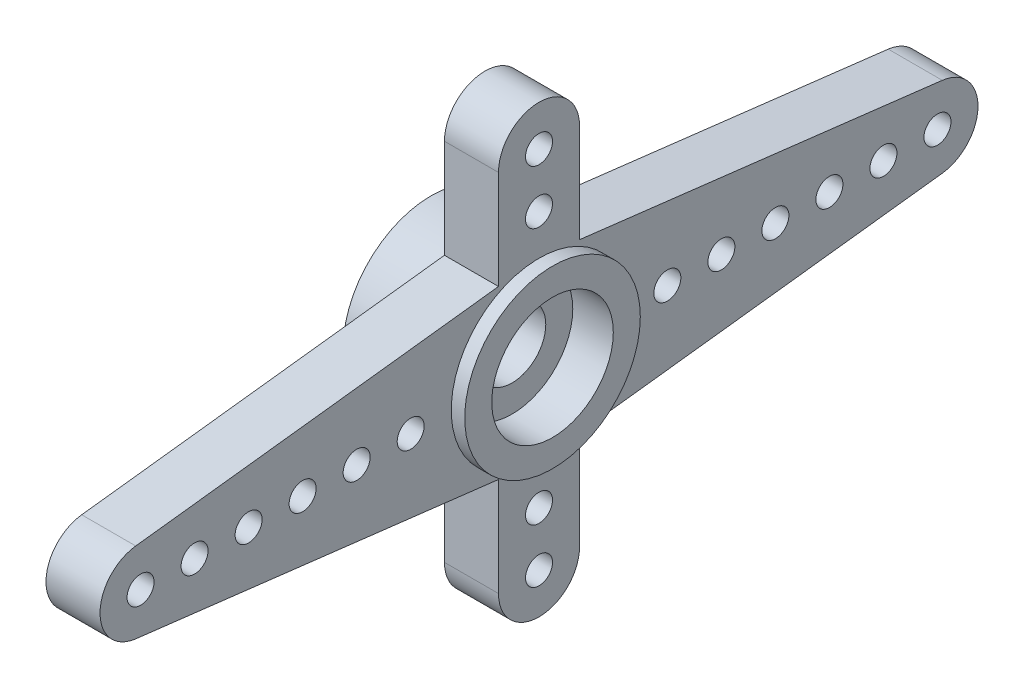
ISO-10303-21;
HEADER;
FILE_DESCRIPTION(('STEP AP214'),'2;1');
FILE_NAME('part.step','',(''),(''),'','','');
FILE_SCHEMA(('AUTOMOTIVE_DESIGN { 1 0 10303 214 1 1 1 1 }'));
ENDSEC;
DATA;
#1=APPLICATION_CONTEXT('core data for automotive mechanical design processes');
#2=APPLICATION_PROTOCOL_DEFINITION('international standard','automotive_design',2000,#1);
#3=PRODUCT_CONTEXT('',#1,'mechanical');
#4=PRODUCT('Part','Part','',(#3));
#5=PRODUCT_RELATED_PRODUCT_CATEGORY('part','',(#4));
#6=PRODUCT_DEFINITION_FORMATION('','',#4);
#7=PRODUCT_DEFINITION_CONTEXT('part definition',#1,'design');
#8=PRODUCT_DEFINITION('design','',#6,#7);
#9=PRODUCT_DEFINITION_SHAPE('','',#8);
#10=(LENGTH_UNIT() NAMED_UNIT(*) SI_UNIT(.MILLI.,.METRE.));
#11=(NAMED_UNIT(*) PLANE_ANGLE_UNIT() SI_UNIT($,.RADIAN.));
#12=(NAMED_UNIT(*) SI_UNIT($,.STERADIAN.) SOLID_ANGLE_UNIT());
#13=UNCERTAINTY_MEASURE_WITH_UNIT(LENGTH_MEASURE(1.E-05),#10,'distance_accuracy_value','');
#14=(GEOMETRIC_REPRESENTATION_CONTEXT(3) GLOBAL_UNCERTAINTY_ASSIGNED_CONTEXT((#13)) GLOBAL_UNIT_ASSIGNED_CONTEXT((#10,
#11,#12)) REPRESENTATION_CONTEXT('',''));
#15=CARTESIAN_POINT('',(0.,0.,0.));
#16=DIRECTION('',(0.,0.,1.));
#17=DIRECTION('',(1.,0.,0.));
#18=AXIS2_PLACEMENT_3D('',#15,#16,#17);
#19=CARTESIAN_POINT('',(0.,0.,0.));
#20=DIRECTION('',(1.,0.,0.));
#21=DIRECTION('',(0.,0.,-1.));
#22=AXIS2_PLACEMENT_3D('',#19,#20,#21);
#23=CYLINDRICAL_SURFACE('',#22,1.25);
#24=CARTESIAN_POINT('',(0.,0.,0.));
#25=DIRECTION('',(1.,0.,0.));
#26=DIRECTION('',(0.,0.,-1.));
#27=AXIS2_PLACEMENT_3D('',#24,#25,#26);
#28=CIRCLE('',#27,1.25);
#29=CARTESIAN_POINT('',(0.,0.,-1.25));
#30=VERTEX_POINT('',#29);
#31=EDGE_CURVE('E710',#30,#30,#28,.T.);
#32=ORIENTED_EDGE('',*,*,#31,.F.);
#33=EDGE_LOOP('',(#32));
#34=FACE_BOUND('',#33,.T.);
#35=CARTESIAN_POINT('',(1.,0.,0.));
#36=DIRECTION('',(1.,0.,0.));
#37=DIRECTION('',(0.,0.,-1.));
#38=AXIS2_PLACEMENT_3D('',#35,#36,#37);
#39=CIRCLE('',#38,1.25);
#40=CARTESIAN_POINT('',(1.,0.,-1.25));
#41=VERTEX_POINT('',#40);
#42=EDGE_CURVE('E676',#41,#41,#39,.T.);
#43=ORIENTED_EDGE('',*,*,#42,.T.);
#44=EDGE_LOOP('',(#43));
#45=FACE_BOUND('',#44,.T.);
#46=ADVANCED_FACE('F39',(#34,#45),#23,.F.);
#47=CARTESIAN_POINT('',(0.,0.,14.75));
#48=DIRECTION('',(1.,0.,0.));
#49=DIRECTION('',(0.,0.,-1.));
#50=AXIS2_PLACEMENT_3D('',#47,#48,#49);
#51=PLANE('',#50);
#52=ORIENTED_EDGE('',*,*,#31,.T.);
#53=EDGE_LOOP('',(#52));
#54=FACE_BOUND('',#53,.T.);
#55=CARTESIAN_POINT('',(0.,0.,0.));
#56=DIRECTION('',(-1.,0.,0.));
#57=DIRECTION('',(0.,0.,1.));
#58=AXIS2_PLACEMENT_3D('',#55,#56,#57);
#59=CIRCLE('',#58,2.25);
#60=CARTESIAN_POINT('',(0.,0.,2.25));
#61=VERTEX_POINT('',#60);
#62=EDGE_CURVE('E695',#61,#61,#59,.T.);
#63=ORIENTED_EDGE('',*,*,#62,.T.);
#64=EDGE_LOOP('',(#63));
#65=FACE_BOUND('',#64,.T.);
#66=ADVANCED_FACE('F307',(#54,#65),#51,.F.);
#67=CARTESIAN_POINT('',(2.,0.,14.75));
#68=DIRECTION('',(1.,0.,0.));
#69=DIRECTION('',(0.,0.,-1.));
#70=AXIS2_PLACEMENT_3D('',#67,#68,#69);
#71=PLANE('',#70);
#72=CARTESIAN_POINT('',(2.,0.,0.));
#73=DIRECTION('',(1.,0.,0.));
#74=DIRECTION('',(0.,0.,-1.));
#75=AXIS2_PLACEMENT_3D('',#72,#73,#74);
#76=CIRCLE('',#75,3.25);
#77=CARTESIAN_POINT('',(2.,0.,-3.25));
#78=VERTEX_POINT('',#77);
#79=EDGE_CURVE('E687',#78,#78,#76,.T.);
#80=ORIENTED_EDGE('',*,*,#79,.F.);
#81=EDGE_LOOP('',(#80));
#82=FACE_BOUND('',#81,.T.);
#83=CARTESIAN_POINT('',(2.,-4.75,0.));
#84=DIRECTION('',(1.,0.,0.));
#85=DIRECTION('',(0.,0.,1.));
#86=AXIS2_PLACEMENT_3D('',#83,#84,#85);
#87=CIRCLE('',#86,0.5);
#88=CARTESIAN_POINT('',(2.,-4.75,0.5));
#89=VERTEX_POINT('',#88);
#90=EDGE_CURVE('E723',#89,#89,#87,.T.);
#91=ORIENTED_EDGE('',*,*,#90,.F.);
#92=EDGE_LOOP('',(#91));
#93=FACE_BOUND('',#92,.T.);
#94=CARTESIAN_POINT('',(2.,4.75,0.));
#95=DIRECTION('',(1.,0.,0.));
#96=DIRECTION('',(0.,0.,-1.));
#97=AXIS2_PLACEMENT_3D('',#94,#95,#96);
#98=CIRCLE('',#97,0.5);
#99=CARTESIAN_POINT('',(2.,4.75,-0.5));
#100=VERTEX_POINT('',#99);
#101=EDGE_CURVE('E739',#100,#100,#98,.T.);
#102=ORIENTED_EDGE('',*,*,#101,.F.);
#103=EDGE_LOOP('',(#102));
#104=FACE_BOUND('',#103,.T.);
#105=CARTESIAN_POINT('',(2.,0.,6.75));
#106=DIRECTION('',(1.,0.,0.));
#107=DIRECTION('',(0.,0.,1.));
#108=AXIS2_PLACEMENT_3D('',#105,#106,#107);
#109=CIRCLE('',#108,0.500000000000001);
#110=CARTESIAN_POINT('',(2.,0.,7.25));
#111=VERTEX_POINT('',#110);
#112=EDGE_CURVE('E755',#111,#111,#109,.T.);
#113=ORIENTED_EDGE('',*,*,#112,.F.);
#114=EDGE_LOOP('',(#113));
#115=FACE_BOUND('',#114,.T.);
#116=CARTESIAN_POINT('',(2.,0.,10.75));
#117=DIRECTION('',(1.,0.,0.));
#118=DIRECTION('',(0.,0.,1.));
#119=AXIS2_PLACEMENT_3D('',#116,#117,#118);
#120=CIRCLE('',#119,0.500000000000002);
#121=CARTESIAN_POINT('',(2.,0.,11.25));
#122=VERTEX_POINT('',#121);
#123=EDGE_CURVE('E771',#122,#122,#120,.T.);
#124=ORIENTED_EDGE('',*,*,#123,.F.);
#125=EDGE_LOOP('',(#124));
#126=FACE_BOUND('',#125,.T.);
#127=CARTESIAN_POINT('',(2.,0.,14.75));
#128=DIRECTION('',(1.,0.,0.));
#129=DIRECTION('',(0.,0.,1.));
#130=AXIS2_PLACEMENT_3D('',#127,#128,#129);
#131=CIRCLE('',#130,0.500000000000002);
#132=CARTESIAN_POINT('',(2.,0.,15.25));
#133=VERTEX_POINT('',#132);
#134=EDGE_CURVE('E787',#133,#133,#131,.T.);
#135=ORIENTED_EDGE('',*,*,#134,.F.);
#136=EDGE_LOOP('',(#135));
#137=FACE_BOUND('',#136,.T.);
#138=CARTESIAN_POINT('',(2.,0.,-12.75));
#139=DIRECTION('',(1.,0.,0.));
#140=DIRECTION('',(0.,0.,-1.));
#141=AXIS2_PLACEMENT_3D('',#138,#139,#140);
#142=CIRCLE('',#141,0.499999999999999);
#143=CARTESIAN_POINT('',(2.,0.,-13.25));
#144=VERTEX_POINT('',#143);
#145=EDGE_CURVE('E803',#144,#144,#142,.T.);
#146=ORIENTED_EDGE('',*,*,#145,.F.);
#147=EDGE_LOOP('',(#146));
#148=FACE_BOUND('',#147,.T.);
#149=CARTESIAN_POINT('',(2.,0.,-8.75));
#150=DIRECTION('',(1.,0.,0.));
#151=DIRECTION('',(0.,0.,-1.));
#152=AXIS2_PLACEMENT_3D('',#149,#150,#151);
#153=CIRCLE('',#152,0.499999999999999);
#154=CARTESIAN_POINT('',(2.,0.,-9.25));
#155=VERTEX_POINT('',#154);
#156=EDGE_CURVE('E819',#155,#155,#153,.T.);
#157=ORIENTED_EDGE('',*,*,#156,.F.);
#158=EDGE_LOOP('',(#157));
#159=FACE_BOUND('',#158,.T.);
#160=CARTESIAN_POINT('',(2.,0.,-4.75));
#161=DIRECTION('',(1.,0.,0.));
#162=DIRECTION('',(0.,0.,-1.));
#163=AXIS2_PLACEMENT_3D('',#160,#161,#162);
#164=CIRCLE('',#163,0.500000000000001);
#165=CARTESIAN_POINT('',(2.,0.,-5.25));
#166=VERTEX_POINT('',#165);
#167=EDGE_CURVE('E172',#166,#166,#164,.T.);
#168=ORIENTED_EDGE('',*,*,#167,.F.);
#169=EDGE_LOOP('',(#168));
#170=FACE_BOUND('',#169,.T.);
#171=CARTESIAN_POINT('',(2.,0.,14.75));
#172=DIRECTION('',(1.,0.,0.));
#173=DIRECTION('',(0.,0.,-1.));
#174=AXIS2_PLACEMENT_3D('',#171,#172,#173);
#175=CIRCLE('',#174,1.5);
#176=CARTESIAN_POINT('',(2.,1.48940527280103,14.9279661016949));
#177=VERTEX_POINT('',#176);
#178=CARTESIAN_POINT('',(2.,-1.48940527280103,14.9279661016949));
#179=VERTEX_POINT('',#178);
#180=EDGE_CURVE('E202',#177,#179,#175,.T.);
#181=ORIENTED_EDGE('',*,*,#180,.T.);
#182=DIRECTION('',(0.,-0.11864406779661,-0.992936848534021));
#183=VECTOR('',#182,1.);
#184=CARTESIAN_POINT('',(2.,-1.48940527280103,14.9279661016949));
#185=LINE('',#184,#183);
#186=CARTESIAN_POINT('',(2.,-3.0938864871826,1.5));
#187=VERTEX_POINT('',#186);
#188=EDGE_CURVE('E113',#179,#187,#185,.T.);
#189=ORIENTED_EDGE('',*,*,#188,.T.);
#190=DIRECTION('',(0.,-1.,0.));
#191=VECTOR('',#190,1.);
#192=CARTESIAN_POINT('',(2.,-6.75,1.5));
#193=LINE('',#192,#191);
#194=CARTESIAN_POINT('',(2.,-6.75,1.5));
#195=VERTEX_POINT('',#194);
#196=EDGE_CURVE('E260',#187,#195,#193,.T.);
#197=ORIENTED_EDGE('',*,*,#196,.T.);
#198=CARTESIAN_POINT('',(2.,-6.75,0.));
#199=DIRECTION('',(1.,0.,0.));
#200=DIRECTION('',(0.,0.,1.));
#201=AXIS2_PLACEMENT_3D('',#198,#199,#200);
#202=CIRCLE('',#201,1.5);
#203=CARTESIAN_POINT('',(2.,-6.75,-1.5));
#204=VERTEX_POINT('',#203);
#205=EDGE_CURVE('E256',#195,#204,#202,.T.);
#206=ORIENTED_EDGE('',*,*,#205,.T.);
#207=DIRECTION('',(0.,1.,0.));
#208=VECTOR('',#207,1.);
#209=CARTESIAN_POINT('',(2.,-6.75,-1.5));
#210=LINE('',#209,#208);
#211=CARTESIAN_POINT('',(2.,-3.0938864871826,-1.5));
#212=VERTEX_POINT('',#211);
#213=EDGE_CURVE('E259',#204,#212,#210,.T.);
#214=ORIENTED_EDGE('',*,*,#213,.T.);
#215=DIRECTION('',(0.,0.11864406779661,-0.992936848534021));
#216=VECTOR('',#215,1.);
#217=CARTESIAN_POINT('',(2.,-1.48940527280103,-14.9279661016949));
#218=LINE('',#217,#216);
#219=CARTESIAN_POINT('',(2.,-1.48940527280103,-14.9279661016949));
#220=VERTEX_POINT('',#219);
#221=EDGE_CURVE('E264',#212,#220,#218,.T.);
#222=ORIENTED_EDGE('',*,*,#221,.T.);
#223=CARTESIAN_POINT('',(2.,0.,-14.75));
#224=DIRECTION('',(1.,0.,0.));
#225=DIRECTION('',(0.,0.,1.));
#226=AXIS2_PLACEMENT_3D('',#223,#224,#225);
#227=CIRCLE('',#226,1.5);
#228=CARTESIAN_POINT('',(2.,1.48940527280103,-14.9279661016949));
#229=VERTEX_POINT('',#228);
#230=EDGE_CURVE('E271',#220,#229,#227,.T.);
#231=ORIENTED_EDGE('',*,*,#230,.T.);
#232=DIRECTION('',(0.,0.11864406779661,0.992936848534021));
#233=VECTOR('',#232,1.);
#234=CARTESIAN_POINT('',(2.,1.48940527280103,-14.9279661016949));
#235=LINE('',#234,#233);
#236=CARTESIAN_POINT('',(2.,3.0938864871826,-1.5));
#237=VERTEX_POINT('',#236);
#238=EDGE_CURVE('E274',#229,#237,#235,.T.);
#239=ORIENTED_EDGE('',*,*,#238,.T.);
#240=DIRECTION('',(0.,1.,0.));
#241=VECTOR('',#240,1.);
#242=CARTESIAN_POINT('',(2.,6.75,-1.5));
#243=LINE('',#242,#241);
#244=CARTESIAN_POINT('',(2.,6.75,-1.5));
#245=VERTEX_POINT('',#244);
#246=EDGE_CURVE('E145',#237,#245,#243,.T.);
#247=ORIENTED_EDGE('',*,*,#246,.T.);
#248=CARTESIAN_POINT('',(2.,6.75,0.));
#249=DIRECTION('',(1.,0.,0.));
#250=DIRECTION('',(0.,0.,-1.));
#251=AXIS2_PLACEMENT_3D('',#248,#249,#250);
#252=CIRCLE('',#251,1.5);
#253=CARTESIAN_POINT('',(2.,6.75,1.5));
#254=VERTEX_POINT('',#253);
#255=EDGE_CURVE('E138',#245,#254,#252,.T.);
#256=ORIENTED_EDGE('',*,*,#255,.T.);
#257=DIRECTION('',(0.,-1.,0.));
#258=VECTOR('',#257,1.);
#259=CARTESIAN_POINT('',(2.,6.75,1.5));
#260=LINE('',#259,#258);
#261=CARTESIAN_POINT('',(2.,3.0938864871826,1.5));
#262=VERTEX_POINT('',#261);
#263=EDGE_CURVE('E143',#254,#262,#260,.T.);
#264=ORIENTED_EDGE('',*,*,#263,.T.);
#265=DIRECTION('',(0.,-0.11864406779661,0.992936848534021));
#266=VECTOR('',#265,1.);
#267=CARTESIAN_POINT('',(2.,1.48940527280103,14.9279661016949));
#268=LINE('',#267,#266);
#269=EDGE_CURVE('E57',#262,#177,#268,.T.);
#270=ORIENTED_EDGE('',*,*,#269,.T.);
#271=EDGE_LOOP('',(#181,#189,#197,#206,#214,#222,#231,#239,#247,#256,#264,#270));
#272=FACE_BOUND('',#271,.T.);
#273=CARTESIAN_POINT('',(2.,0.,-6.75));
#274=DIRECTION('',(1.,0.,0.));
#275=DIRECTION('',(0.,0.,-1.));
#276=AXIS2_PLACEMENT_3D('',#273,#274,#275);
#277=CIRCLE('',#276,0.500000000000001);
#278=CARTESIAN_POINT('',(2.,0.,-7.25));
#279=VERTEX_POINT('',#278);
#280=EDGE_CURVE('E827',#279,#279,#277,.T.);
#281=ORIENTED_EDGE('',*,*,#280,.F.);
#282=EDGE_LOOP('',(#281));
#283=FACE_BOUND('',#282,.T.);
#284=CARTESIAN_POINT('',(2.,0.,-10.75));
#285=DIRECTION('',(1.,0.,0.));
#286=DIRECTION('',(0.,0.,-1.));
#287=AXIS2_PLACEMENT_3D('',#284,#285,#286);
#288=CIRCLE('',#287,0.500000000000002);
#289=CARTESIAN_POINT('',(2.,0.,-11.25));
#290=VERTEX_POINT('',#289);
#291=EDGE_CURVE('E811',#290,#290,#288,.T.);
#292=ORIENTED_EDGE('',*,*,#291,.F.);
#293=EDGE_LOOP('',(#292));
#294=FACE_BOUND('',#293,.T.);
#295=CARTESIAN_POINT('',(2.,0.,-14.75));
#296=DIRECTION('',(1.,0.,0.));
#297=DIRECTION('',(0.,0.,-1.));
#298=AXIS2_PLACEMENT_3D('',#295,#296,#297);
#299=CIRCLE('',#298,0.500000000000002);
#300=CARTESIAN_POINT('',(2.,0.,-15.25));
#301=VERTEX_POINT('',#300);
#302=EDGE_CURVE('E795',#301,#301,#299,.T.);
#303=ORIENTED_EDGE('',*,*,#302,.F.);
#304=EDGE_LOOP('',(#303));
#305=FACE_BOUND('',#304,.T.);
#306=CARTESIAN_POINT('',(2.,0.,12.75));
#307=DIRECTION('',(1.,0.,0.));
#308=DIRECTION('',(0.,0.,1.));
#309=AXIS2_PLACEMENT_3D('',#306,#307,#308);
#310=CIRCLE('',#309,0.499999999999999);
#311=CARTESIAN_POINT('',(2.,0.,13.25));
#312=VERTEX_POINT('',#311);
#313=EDGE_CURVE('E779',#312,#312,#310,.T.);
#314=ORIENTED_EDGE('',*,*,#313,.F.);
#315=EDGE_LOOP('',(#314));
#316=FACE_BOUND('',#315,.T.);
#317=CARTESIAN_POINT('',(2.,0.,8.75));
#318=DIRECTION('',(1.,0.,0.));
#319=DIRECTION('',(0.,0.,1.));
#320=AXIS2_PLACEMENT_3D('',#317,#318,#319);
#321=CIRCLE('',#320,0.499999999999999);
#322=CARTESIAN_POINT('',(2.,0.,9.25));
#323=VERTEX_POINT('',#322);
#324=EDGE_CURVE('E763',#323,#323,#321,.T.);
#325=ORIENTED_EDGE('',*,*,#324,.F.);
#326=EDGE_LOOP('',(#325));
#327=FACE_BOUND('',#326,.T.);
#328=CARTESIAN_POINT('',(2.,0.,4.75));
#329=DIRECTION('',(1.,0.,0.));
#330=DIRECTION('',(0.,0.,1.));
#331=AXIS2_PLACEMENT_3D('',#328,#329,#330);
#332=CIRCLE('',#331,0.500000000000001);
#333=CARTESIAN_POINT('',(2.,0.,5.25));
#334=VERTEX_POINT('',#333);
#335=EDGE_CURVE('E747',#334,#334,#332,.T.);
#336=ORIENTED_EDGE('',*,*,#335,.F.);
#337=EDGE_LOOP('',(#336));
#338=FACE_BOUND('',#337,.T.);
#339=CARTESIAN_POINT('',(2.,6.75,0.));
#340=DIRECTION('',(1.,0.,0.));
#341=DIRECTION('',(0.,0.,-1.));
#342=AXIS2_PLACEMENT_3D('',#339,#340,#341);
#343=CIRCLE('',#342,0.5);
#344=CARTESIAN_POINT('',(2.,6.75,-0.5));
#345=VERTEX_POINT('',#344);
#346=EDGE_CURVE('E731',#345,#345,#343,.T.);
#347=ORIENTED_EDGE('',*,*,#346,.F.);
#348=EDGE_LOOP('',(#347));
#349=FACE_BOUND('',#348,.T.);
#350=CARTESIAN_POINT('',(2.,-6.75,0.));
#351=DIRECTION('',(1.,0.,0.));
#352=DIRECTION('',(0.,0.,1.));
#353=AXIS2_PLACEMENT_3D('',#350,#351,#352);
#354=CIRCLE('',#353,0.5);
#355=CARTESIAN_POINT('',(2.,-6.75,0.5));
#356=VERTEX_POINT('',#355);
#357=EDGE_CURVE('E715',#356,#356,#354,.T.);
#358=ORIENTED_EDGE('',*,*,#357,.F.);
#359=EDGE_LOOP('',(#358));
#360=FACE_BOUND('',#359,.T.);
#361=ADVANCED_FACE('F140',(#82,#93,#104,#115,#126,#137,#148,#159,#170,#272,#283,#294,#305,#316,
#327,#338,#349,#360),#71,.T.);
#362=CARTESIAN_POINT('',(0.,0.,0.));
#363=DIRECTION('',(1.,0.,0.));
#364=DIRECTION('',(0.,0.,-1.));
#365=AXIS2_PLACEMENT_3D('',#362,#363,#364);
#366=CIRCLE('',#365,3.25);
#367=CARTESIAN_POINT('',(0.,0.,-3.25));
#368=VERTEX_POINT('',#367);
#369=EDGE_CURVE('E11',#368,#368,#366,.F.);
#370=ORIENTED_EDGE('',*,*,#369,.F.);
#371=EDGE_LOOP('',(#370));
#372=FACE_BOUND('',#371,.T.);
#373=CARTESIAN_POINT('',(0.,0.,14.75));
#374=DIRECTION('',(1.,0.,0.));
#375=DIRECTION('',(0.,0.,-1.));
#376=AXIS2_PLACEMENT_3D('',#373,#374,#375);
#377=CIRCLE('',#376,1.5);
#378=CARTESIAN_POINT('',(0.,1.48940527280103,14.9279661016949));
#379=VERTEX_POINT('',#378);
#380=CARTESIAN_POINT('',(0.,-1.48940527280103,14.9279661016949));
#381=VERTEX_POINT('',#380);
#382=EDGE_CURVE('E167',#379,#381,#377,.T.);
#383=ORIENTED_EDGE('',*,*,#382,.F.);
#384=DIRECTION('',(0.,-0.11864406779661,0.992936848534021));
#385=VECTOR('',#384,1.);
#386=CARTESIAN_POINT('',(0.,1.48940527280103,14.9279661016949));
#387=LINE('',#386,#385);
#388=CARTESIAN_POINT('',(0.,3.0938864871826,1.5));
#389=VERTEX_POINT('',#388);
#390=EDGE_CURVE('E104',#389,#379,#387,.T.);
#391=ORIENTED_EDGE('',*,*,#390,.F.);
#392=DIRECTION('',(0.,-1.,0.));
#393=VECTOR('',#392,1.);
#394=CARTESIAN_POINT('',(0.,6.75,1.5));
#395=LINE('',#394,#393);
#396=CARTESIAN_POINT('',(0.,6.75,1.5));
#397=VERTEX_POINT('',#396);
#398=EDGE_CURVE('E98',#397,#389,#395,.T.);
#399=ORIENTED_EDGE('',*,*,#398,.F.);
#400=CARTESIAN_POINT('',(0.,6.75,0.));
#401=DIRECTION('',(1.,0.,0.));
#402=DIRECTION('',(0.,0.,-1.));
#403=AXIS2_PLACEMENT_3D('',#400,#401,#402);
#404=CIRCLE('',#403,1.5);
#405=CARTESIAN_POINT('',(0.,6.75,-1.5));
#406=VERTEX_POINT('',#405);
#407=EDGE_CURVE('E154',#406,#397,#404,.T.);
#408=ORIENTED_EDGE('',*,*,#407,.F.);
#409=DIRECTION('',(0.,1.,0.));
#410=VECTOR('',#409,1.);
#411=CARTESIAN_POINT('',(0.,6.75,-1.5));
#412=LINE('',#411,#410);
#413=CARTESIAN_POINT('',(0.,3.0938864871826,-1.5));
#414=VERTEX_POINT('',#413);
#415=EDGE_CURVE('E193',#414,#406,#412,.T.);
#416=ORIENTED_EDGE('',*,*,#415,.F.);
#417=DIRECTION('',(0.,0.11864406779661,0.992936848534021));
#418=VECTOR('',#417,1.);
#419=CARTESIAN_POINT('',(0.,1.48940527280103,-14.9279661016949));
#420=LINE('',#419,#418);
#421=CARTESIAN_POINT('',(0.,1.48940527280103,-14.9279661016949));
#422=VERTEX_POINT('',#421);
#423=EDGE_CURVE('E190',#422,#414,#420,.T.);
#424=ORIENTED_EDGE('',*,*,#423,.F.);
#425=CARTESIAN_POINT('',(0.,0.,-14.75));
#426=DIRECTION('',(1.,0.,0.));
#427=DIRECTION('',(0.,0.,1.));
#428=AXIS2_PLACEMENT_3D('',#425,#426,#427);
#429=CIRCLE('',#428,1.5);
#430=CARTESIAN_POINT('',(0.,-1.48940527280103,-14.9279661016949));
#431=VERTEX_POINT('',#430);
#432=EDGE_CURVE('E187',#431,#422,#429,.T.);
#433=ORIENTED_EDGE('',*,*,#432,.F.);
#434=DIRECTION('',(0.,0.11864406779661,-0.992936848534021));
#435=VECTOR('',#434,1.);
#436=CARTESIAN_POINT('',(0.,-1.48940527280103,-14.9279661016949));
#437=LINE('',#436,#435);
#438=CARTESIAN_POINT('',(0.,-3.0938864871826,-1.5));
#439=VERTEX_POINT('',#438);
#440=EDGE_CURVE('E184',#439,#431,#437,.T.);
#441=ORIENTED_EDGE('',*,*,#440,.F.);
#442=DIRECTION('',(0.,1.,0.));
#443=VECTOR('',#442,1.);
#444=CARTESIAN_POINT('',(0.,-6.75,-1.5));
#445=LINE('',#444,#443);
#446=CARTESIAN_POINT('',(0.,-6.75,-1.5));
#447=VERTEX_POINT('',#446);
#448=EDGE_CURVE('E181',#447,#439,#445,.T.);
#449=ORIENTED_EDGE('',*,*,#448,.F.);
#450=CARTESIAN_POINT('',(0.,-6.75,0.));
#451=DIRECTION('',(1.,0.,0.));
#452=DIRECTION('',(0.,0.,1.));
#453=AXIS2_PLACEMENT_3D('',#450,#451,#452);
#454=CIRCLE('',#453,1.5);
#455=CARTESIAN_POINT('',(0.,-6.75,1.5));
#456=VERTEX_POINT('',#455);
#457=EDGE_CURVE('E178',#456,#447,#454,.T.);
#458=ORIENTED_EDGE('',*,*,#457,.F.);
#459=DIRECTION('',(0.,-1.,0.));
#460=VECTOR('',#459,1.);
#461=CARTESIAN_POINT('',(0.,-6.75,1.5));
#462=LINE('',#461,#460);
#463=CARTESIAN_POINT('',(0.,-3.0938864871826,1.5));
#464=VERTEX_POINT('',#463);
#465=EDGE_CURVE('E175',#464,#456,#462,.T.);
#466=ORIENTED_EDGE('',*,*,#465,.F.);
#467=DIRECTION('',(0.,-0.11864406779661,-0.992936848534021));
#468=VECTOR('',#467,1.);
#469=CARTESIAN_POINT('',(0.,-1.48940527280103,14.9279661016949));
#470=LINE('',#469,#468);
#471=EDGE_CURVE('E171',#381,#464,#470,.T.);
#472=ORIENTED_EDGE('',*,*,#471,.F.);
#473=EDGE_LOOP('',(#383,#391,#399,#408,#416,#424,#433,#441,#449,#458,#466,#472));
#474=FACE_BOUND('',#473,.T.);
#475=CARTESIAN_POINT('',(0.,0.,-4.75));
#476=DIRECTION('',(1.,0.,0.));
#477=DIRECTION('',(0.,0.,-1.));
#478=AXIS2_PLACEMENT_3D('',#475,#476,#477);
#479=CIRCLE('',#478,0.500000000000001);
#480=CARTESIAN_POINT('',(0.,0.,-5.25));
#481=VERTEX_POINT('',#480);
#482=EDGE_CURVE('E831',#481,#481,#479,.T.);
#483=ORIENTED_EDGE('',*,*,#482,.T.);
#484=EDGE_LOOP('',(#483));
#485=FACE_BOUND('',#484,.T.);
#486=CARTESIAN_POINT('',(0.,0.,-6.75));
#487=DIRECTION('',(1.,0.,0.));
#488=DIRECTION('',(0.,0.,-1.));
#489=AXIS2_PLACEMENT_3D('',#486,#487,#488);
#490=CIRCLE('',#489,0.500000000000001);
#491=CARTESIAN_POINT('',(0.,0.,-7.25));
#492=VERTEX_POINT('',#491);
#493=EDGE_CURVE('E823',#492,#492,#490,.T.);
#494=ORIENTED_EDGE('',*,*,#493,.T.);
#495=EDGE_LOOP('',(#494));
#496=FACE_BOUND('',#495,.T.);
#497=CARTESIAN_POINT('',(0.,0.,-8.75));
#498=DIRECTION('',(1.,0.,0.));
#499=DIRECTION('',(0.,0.,-1.));
#500=AXIS2_PLACEMENT_3D('',#497,#498,#499);
#501=CIRCLE('',#500,0.499999999999999);
#502=CARTESIAN_POINT('',(0.,0.,-9.25));
#503=VERTEX_POINT('',#502);
#504=EDGE_CURVE('E815',#503,#503,#501,.T.);
#505=ORIENTED_EDGE('',*,*,#504,.T.);
#506=EDGE_LOOP('',(#505));
#507=FACE_BOUND('',#506,.T.);
#508=CARTESIAN_POINT('',(0.,0.,-10.75));
#509=DIRECTION('',(1.,0.,0.));
#510=DIRECTION('',(0.,0.,-1.));
#511=AXIS2_PLACEMENT_3D('',#508,#509,#510);
#512=CIRCLE('',#511,0.500000000000002);
#513=CARTESIAN_POINT('',(0.,0.,-11.25));
#514=VERTEX_POINT('',#513);
#515=EDGE_CURVE('E807',#514,#514,#512,.T.);
#516=ORIENTED_EDGE('',*,*,#515,.T.);
#517=EDGE_LOOP('',(#516));
#518=FACE_BOUND('',#517,.T.);
#519=CARTESIAN_POINT('',(0.,0.,-12.75));
#520=DIRECTION('',(1.,0.,0.));
#521=DIRECTION('',(0.,0.,-1.));
#522=AXIS2_PLACEMENT_3D('',#519,#520,#521);
#523=CIRCLE('',#522,0.499999999999999);
#524=CARTESIAN_POINT('',(0.,0.,-13.25));
#525=VERTEX_POINT('',#524);
#526=EDGE_CURVE('E799',#525,#525,#523,.T.);
#527=ORIENTED_EDGE('',*,*,#526,.T.);
#528=EDGE_LOOP('',(#527));
#529=FACE_BOUND('',#528,.T.);
#530=CARTESIAN_POINT('',(0.,0.,-14.75));
#531=DIRECTION('',(1.,0.,0.));
#532=DIRECTION('',(0.,0.,-1.));
#533=AXIS2_PLACEMENT_3D('',#530,#531,#532);
#534=CIRCLE('',#533,0.500000000000002);
#535=CARTESIAN_POINT('',(0.,0.,-15.25));
#536=VERTEX_POINT('',#535);
#537=EDGE_CURVE('E791',#536,#536,#534,.T.);
#538=ORIENTED_EDGE('',*,*,#537,.T.);
#539=EDGE_LOOP('',(#538));
#540=FACE_BOUND('',#539,.T.);
#541=CARTESIAN_POINT('',(0.,0.,14.75));
#542=DIRECTION('',(1.,0.,0.));
#543=DIRECTION('',(0.,0.,1.));
#544=AXIS2_PLACEMENT_3D('',#541,#542,#543);
#545=CIRCLE('',#544,0.500000000000002);
#546=CARTESIAN_POINT('',(0.,0.,15.25));
#547=VERTEX_POINT('',#546);
#548=EDGE_CURVE('E783',#547,#547,#545,.T.);
#549=ORIENTED_EDGE('',*,*,#548,.T.);
#550=EDGE_LOOP('',(#549));
#551=FACE_BOUND('',#550,.T.);
#552=CARTESIAN_POINT('',(0.,0.,12.75));
#553=DIRECTION('',(1.,0.,0.));
#554=DIRECTION('',(0.,0.,1.));
#555=AXIS2_PLACEMENT_3D('',#552,#553,#554);
#556=CIRCLE('',#555,0.499999999999999);
#557=CARTESIAN_POINT('',(0.,0.,13.25));
#558=VERTEX_POINT('',#557);
#559=EDGE_CURVE('E775',#558,#558,#556,.T.);
#560=ORIENTED_EDGE('',*,*,#559,.T.);
#561=EDGE_LOOP('',(#560));
#562=FACE_BOUND('',#561,.T.);
#563=CARTESIAN_POINT('',(0.,0.,10.75));
#564=DIRECTION('',(1.,0.,0.));
#565=DIRECTION('',(0.,0.,1.));
#566=AXIS2_PLACEMENT_3D('',#563,#564,#565);
#567=CIRCLE('',#566,0.500000000000002);
#568=CARTESIAN_POINT('',(0.,0.,11.25));
#569=VERTEX_POINT('',#568);
#570=EDGE_CURVE('E767',#569,#569,#567,.T.);
#571=ORIENTED_EDGE('',*,*,#570,.T.);
#572=EDGE_LOOP('',(#571));
#573=FACE_BOUND('',#572,.T.);
#574=CARTESIAN_POINT('',(0.,0.,8.75));
#575=DIRECTION('',(1.,0.,0.));
#576=DIRECTION('',(0.,0.,1.));
#577=AXIS2_PLACEMENT_3D('',#574,#575,#576);
#578=CIRCLE('',#577,0.499999999999999);
#579=CARTESIAN_POINT('',(0.,0.,9.25));
#580=VERTEX_POINT('',#579);
#581=EDGE_CURVE('E759',#580,#580,#578,.T.);
#582=ORIENTED_EDGE('',*,*,#581,.T.);
#583=EDGE_LOOP('',(#582));
#584=FACE_BOUND('',#583,.T.);
#585=CARTESIAN_POINT('',(0.,0.,6.75));
#586=DIRECTION('',(1.,0.,0.));
#587=DIRECTION('',(0.,0.,1.));
#588=AXIS2_PLACEMENT_3D('',#585,#586,#587);
#589=CIRCLE('',#588,0.500000000000001);
#590=CARTESIAN_POINT('',(0.,0.,7.25));
#591=VERTEX_POINT('',#590);
#592=EDGE_CURVE('E751',#591,#591,#589,.T.);
#593=ORIENTED_EDGE('',*,*,#592,.T.);
#594=EDGE_LOOP('',(#593));
#595=FACE_BOUND('',#594,.T.);
#596=CARTESIAN_POINT('',(0.,0.,4.75));
#597=DIRECTION('',(1.,0.,0.));
#598=DIRECTION('',(0.,0.,1.));
#599=AXIS2_PLACEMENT_3D('',#596,#597,#598);
#600=CIRCLE('',#599,0.500000000000001);
#601=CARTESIAN_POINT('',(0.,0.,5.25));
#602=VERTEX_POINT('',#601);
#603=EDGE_CURVE('E743',#602,#602,#600,.T.);
#604=ORIENTED_EDGE('',*,*,#603,.T.);
#605=EDGE_LOOP('',(#604));
#606=FACE_BOUND('',#605,.T.);
#607=CARTESIAN_POINT('',(0.,4.75,0.));
#608=DIRECTION('',(1.,0.,0.));
#609=DIRECTION('',(0.,0.,-1.));
#610=AXIS2_PLACEMENT_3D('',#607,#608,#609);
#611=CIRCLE('',#610,0.5);
#612=CARTESIAN_POINT('',(0.,4.75,-0.5));
#613=VERTEX_POINT('',#612);
#614=EDGE_CURVE('E735',#613,#613,#611,.T.);
#615=ORIENTED_EDGE('',*,*,#614,.T.);
#616=EDGE_LOOP('',(#615));
#617=FACE_BOUND('',#616,.T.);
#618=CARTESIAN_POINT('',(0.,6.75,0.));
#619=DIRECTION('',(1.,0.,0.));
#620=DIRECTION('',(0.,0.,-1.));
#621=AXIS2_PLACEMENT_3D('',#618,#619,#620);
#622=CIRCLE('',#621,0.5);
#623=CARTESIAN_POINT('',(0.,6.75,-0.5));
#624=VERTEX_POINT('',#623);
#625=EDGE_CURVE('E727',#624,#624,#622,.T.);
#626=ORIENTED_EDGE('',*,*,#625,.T.);
#627=EDGE_LOOP('',(#626));
#628=FACE_BOUND('',#627,.T.);
#629=CARTESIAN_POINT('',(0.,-4.75,0.));
#630=DIRECTION('',(1.,0.,0.));
#631=DIRECTION('',(0.,0.,1.));
#632=AXIS2_PLACEMENT_3D('',#629,#630,#631);
#633=CIRCLE('',#632,0.5);
#634=CARTESIAN_POINT('',(0.,-4.75,0.5));
#635=VERTEX_POINT('',#634);
#636=EDGE_CURVE('E719',#635,#635,#633,.T.);
#637=ORIENTED_EDGE('',*,*,#636,.T.);
#638=EDGE_LOOP('',(#637));
#639=FACE_BOUND('',#638,.T.);
#640=CARTESIAN_POINT('',(0.,-6.75,0.));
#641=DIRECTION('',(1.,0.,0.));
#642=DIRECTION('',(0.,0.,1.));
#643=AXIS2_PLACEMENT_3D('',#640,#641,#642);
#644=CIRCLE('',#643,0.5);
#645=CARTESIAN_POINT('',(0.,-6.75,0.5));
#646=VERTEX_POINT('',#645);
#647=EDGE_CURVE('E714',#646,#646,#644,.T.);
#648=ORIENTED_EDGE('',*,*,#647,.T.);
#649=EDGE_LOOP('',(#648));
#650=FACE_BOUND('',#649,.T.);
#651=ADVANCED_FACE('F243',(#372,#474,#485,#496,#507,#518,#529,#540,#551,#562,#573,#584,#595,
#606,#617,#628,#639,#650),#51,.F.);
#652=CARTESIAN_POINT('',(2.,0.,14.75));
#653=DIRECTION('',(-1.,0.,0.));
#654=DIRECTION('',(0.,0.,1.));
#655=AXIS2_PLACEMENT_3D('',#652,#653,#654);
#656=CYLINDRICAL_SURFACE('',#655,1.5);
#657=ORIENTED_EDGE('',*,*,#382,.T.);
#658=DIRECTION('',(-1.,0.,0.));
#659=VECTOR('',#658,1.);
#660=CARTESIAN_POINT('',(2.,-1.48940527280103,14.9279661016949));
#661=LINE('',#660,#659);
#662=EDGE_CURVE('E49',#179,#381,#661,.T.);
#663=ORIENTED_EDGE('',*,*,#662,.F.);
#664=ORIENTED_EDGE('',*,*,#180,.F.);
#665=DIRECTION('',(-1.,0.,0.));
#666=VECTOR('',#665,1.);
#667=CARTESIAN_POINT('',(2.,1.48940527280103,14.9279661016949));
#668=LINE('',#667,#666);
#669=EDGE_CURVE('E163',#177,#379,#668,.T.);
#670=ORIENTED_EDGE('',*,*,#669,.T.);
#671=EDGE_LOOP('',(#657,#663,#664,#670));
#672=FACE_BOUND('',#671,.T.);
#673=ADVANCED_FACE('F41',(#672),#656,.T.);
#674=CARTESIAN_POINT('',(2.,-1.48940527280103,14.9279661016949));
#675=DIRECTION('',(0.,0.992936848534021,-0.11864406779661));
#676=DIRECTION('',(0.,0.11864406779661,0.992936848534021));
#677=AXIS2_PLACEMENT_3D('',#674,#675,#676);
#678=PLANE('',#677);
#679=ORIENTED_EDGE('',*,*,#471,.T.);
#680=DIRECTION('',(-1.,0.,0.));
#681=VECTOR('',#680,1.);
#682=CARTESIAN_POINT('',(2.,-3.0938864871826,1.5));
#683=LINE('',#682,#681);
#684=EDGE_CURVE('E233',#187,#464,#683,.T.);
#685=ORIENTED_EDGE('',*,*,#684,.F.);
#686=ORIENTED_EDGE('',*,*,#188,.F.);
#687=ORIENTED_EDGE('',*,*,#662,.T.);
#688=EDGE_LOOP('',(#679,#685,#686,#687));
#689=FACE_BOUND('',#688,.T.);
#690=ADVANCED_FACE('F238',(#689),#678,.F.);
#691=CARTESIAN_POINT('',(2.,-6.75,1.5));
#692=DIRECTION('',(0.,0.,-1.));
#693=DIRECTION('',(0.,1.,0.));
#694=AXIS2_PLACEMENT_3D('',#691,#692,#693);
#695=PLANE('',#694);
#696=ORIENTED_EDGE('',*,*,#465,.T.);
#697=DIRECTION('',(-1.,0.,0.));
#698=VECTOR('',#697,1.);
#699=CARTESIAN_POINT('',(2.,-6.75,1.5));
#700=LINE('',#699,#698);
#701=EDGE_CURVE('E229',#195,#456,#700,.T.);
#702=ORIENTED_EDGE('',*,*,#701,.F.);
#703=ORIENTED_EDGE('',*,*,#196,.F.);
#704=ORIENTED_EDGE('',*,*,#684,.T.);
#705=EDGE_LOOP('',(#696,#702,#703,#704));
#706=FACE_BOUND('',#705,.T.);
#707=ADVANCED_FACE('F250',(#706),#695,.F.);
#708=CARTESIAN_POINT('',(2.,-6.75,0.));
#709=DIRECTION('',(-1.,0.,0.));
#710=DIRECTION('',(0.,0.,1.));
#711=AXIS2_PLACEMENT_3D('',#708,#709,#710);
#712=CYLINDRICAL_SURFACE('',#711,1.5);
#713=ORIENTED_EDGE('',*,*,#457,.T.);
#714=DIRECTION('',(-1.,0.,0.));
#715=VECTOR('',#714,1.);
#716=CARTESIAN_POINT('',(2.,-6.75,-1.5));
#717=LINE('',#716,#715);
#718=EDGE_CURVE('E225',#204,#447,#717,.T.);
#719=ORIENTED_EDGE('',*,*,#718,.F.);
#720=ORIENTED_EDGE('',*,*,#205,.F.);
#721=ORIENTED_EDGE('',*,*,#701,.T.);
#722=EDGE_LOOP('',(#713,#719,#720,#721));
#723=FACE_BOUND('',#722,.T.);
#724=ADVANCED_FACE('F254',(#723),#712,.T.);
#725=CARTESIAN_POINT('',(2.,-6.75,-1.5));
#726=DIRECTION('',(0.,0.,1.));
#727=DIRECTION('',(0.,-1.,0.));
#728=AXIS2_PLACEMENT_3D('',#725,#726,#727);
#729=PLANE('',#728);
#730=ORIENTED_EDGE('',*,*,#448,.T.);
#731=DIRECTION('',(-1.,0.,0.));
#732=VECTOR('',#731,1.);
#733=CARTESIAN_POINT('',(2.,-3.0938864871826,-1.5));
#734=LINE('',#733,#732);
#735=EDGE_CURVE('E221',#212,#439,#734,.T.);
#736=ORIENTED_EDGE('',*,*,#735,.F.);
#737=ORIENTED_EDGE('',*,*,#213,.F.);
#738=ORIENTED_EDGE('',*,*,#718,.T.);
#739=EDGE_LOOP('',(#730,#736,#737,#738));
#740=FACE_BOUND('',#739,.T.);
#741=ADVANCED_FACE('F297',(#740),#729,.F.);
#742=CARTESIAN_POINT('',(2.,-1.48940527280103,-14.9279661016949));
#743=DIRECTION('',(0.,0.992936848534021,0.11864406779661));
#744=DIRECTION('',(0.,-0.11864406779661,0.992936848534021));
#745=AXIS2_PLACEMENT_3D('',#742,#743,#744);
#746=PLANE('',#745);
#747=ORIENTED_EDGE('',*,*,#440,.T.);
#748=DIRECTION('',(-1.,0.,0.));
#749=VECTOR('',#748,1.);
#750=CARTESIAN_POINT('',(2.,-1.48940527280103,-14.9279661016949));
#751=LINE('',#750,#749);
#752=EDGE_CURVE('E217',#220,#431,#751,.T.);
#753=ORIENTED_EDGE('',*,*,#752,.F.);
#754=ORIENTED_EDGE('',*,*,#221,.F.);
#755=ORIENTED_EDGE('',*,*,#735,.T.);
#756=EDGE_LOOP('',(#747,#753,#754,#755));
#757=FACE_BOUND('',#756,.T.);
#758=ADVANCED_FACE('F294',(#757),#746,.F.);
#759=CARTESIAN_POINT('',(2.,0.,-14.75));
#760=DIRECTION('',(-1.,0.,0.));
#761=DIRECTION('',(0.,0.,1.));
#762=AXIS2_PLACEMENT_3D('',#759,#760,#761);
#763=CYLINDRICAL_SURFACE('',#762,1.5);
#764=ORIENTED_EDGE('',*,*,#432,.T.);
#765=DIRECTION('',(-1.,0.,0.));
#766=VECTOR('',#765,1.);
#767=CARTESIAN_POINT('',(2.,1.48940527280103,-14.9279661016949));
#768=LINE('',#767,#766);
#769=EDGE_CURVE('E213',#229,#422,#768,.T.);
#770=ORIENTED_EDGE('',*,*,#769,.F.);
#771=ORIENTED_EDGE('',*,*,#230,.F.);
#772=ORIENTED_EDGE('',*,*,#752,.T.);
#773=EDGE_LOOP('',(#764,#770,#771,#772));
#774=FACE_BOUND('',#773,.T.);
#775=ADVANCED_FACE('F290',(#774),#763,.T.);
#776=CARTESIAN_POINT('',(2.,1.48940527280103,-14.9279661016949));
#777=DIRECTION('',(0.,-0.992936848534021,0.11864406779661));
#778=DIRECTION('',(0.,-0.11864406779661,-0.992936848534021));
#779=AXIS2_PLACEMENT_3D('',#776,#777,#778);
#780=PLANE('',#779);
#781=ORIENTED_EDGE('',*,*,#423,.T.);
#782=DIRECTION('',(-1.,0.,0.));
#783=VECTOR('',#782,1.);
#784=CARTESIAN_POINT('',(2.,3.0938864871826,-1.5));
#785=LINE('',#784,#783);
#786=EDGE_CURVE('E209',#237,#414,#785,.T.);
#787=ORIENTED_EDGE('',*,*,#786,.F.);
#788=ORIENTED_EDGE('',*,*,#238,.F.);
#789=ORIENTED_EDGE('',*,*,#769,.T.);
#790=EDGE_LOOP('',(#781,#787,#788,#789));
#791=FACE_BOUND('',#790,.T.);
#792=ADVANCED_FACE('F282',(#791),#780,.F.);
#793=CARTESIAN_POINT('',(2.,6.75,-1.5));
#794=DIRECTION('',(0.,0.,1.));
#795=DIRECTION('',(0.,-1.,0.));
#796=AXIS2_PLACEMENT_3D('',#793,#794,#795);
#797=PLANE('',#796);
#798=ORIENTED_EDGE('',*,*,#415,.T.);
#799=DIRECTION('',(-1.,0.,0.));
#800=VECTOR('',#799,1.);
#801=CARTESIAN_POINT('',(2.,6.75,-1.5));
#802=LINE('',#801,#800);
#803=EDGE_CURVE('E156',#245,#406,#802,.T.);
#804=ORIENTED_EDGE('',*,*,#803,.F.);
#805=ORIENTED_EDGE('',*,*,#246,.F.);
#806=ORIENTED_EDGE('',*,*,#786,.T.);
#807=EDGE_LOOP('',(#798,#804,#805,#806));
#808=FACE_BOUND('',#807,.T.);
#809=ADVANCED_FACE('F286',(#808),#797,.F.);
#810=CARTESIAN_POINT('',(2.,6.75,0.));
#811=DIRECTION('',(-1.,0.,0.));
#812=DIRECTION('',(0.,0.,1.));
#813=AXIS2_PLACEMENT_3D('',#810,#811,#812);
#814=CYLINDRICAL_SURFACE('',#813,1.5);
#815=ORIENTED_EDGE('',*,*,#407,.T.);
#816=DIRECTION('',(-1.,0.,0.));
#817=VECTOR('',#816,1.);
#818=CARTESIAN_POINT('',(2.,6.75,1.5));
#819=LINE('',#818,#817);
#820=EDGE_CURVE('E151',#254,#397,#819,.T.);
#821=ORIENTED_EDGE('',*,*,#820,.F.);
#822=ORIENTED_EDGE('',*,*,#255,.F.);
#823=ORIENTED_EDGE('',*,*,#803,.T.);
#824=EDGE_LOOP('',(#815,#821,#822,#823));
#825=FACE_BOUND('',#824,.T.);
#826=ADVANCED_FACE('F152',(#825),#814,.T.);
#827=CARTESIAN_POINT('',(2.,6.75,1.5));
#828=DIRECTION('',(0.,0.,-1.));
#829=DIRECTION('',(0.,1.,0.));
#830=AXIS2_PLACEMENT_3D('',#827,#828,#829);
#831=PLANE('',#830);
#832=ORIENTED_EDGE('',*,*,#398,.T.);
#833=DIRECTION('',(-1.,0.,0.));
#834=VECTOR('',#833,1.);
#835=CARTESIAN_POINT('',(2.,3.0938864871826,1.5));
#836=LINE('',#835,#834);
#837=EDGE_CURVE('E157',#262,#389,#836,.T.);
#838=ORIENTED_EDGE('',*,*,#837,.F.);
#839=ORIENTED_EDGE('',*,*,#263,.F.);
#840=ORIENTED_EDGE('',*,*,#820,.T.);
#841=EDGE_LOOP('',(#832,#838,#839,#840));
#842=FACE_BOUND('',#841,.T.);
#843=ADVANCED_FACE('F159',(#842),#831,.F.);
#844=CARTESIAN_POINT('',(2.,1.48940527280103,14.9279661016949));
#845=DIRECTION('',(0.,-0.992936848534021,-0.11864406779661));
#846=DIRECTION('',(0.,0.11864406779661,-0.992936848534021));
#847=AXIS2_PLACEMENT_3D('',#844,#845,#846);
#848=PLANE('',#847);
#849=ORIENTED_EDGE('',*,*,#390,.T.);
#850=ORIENTED_EDGE('',*,*,#669,.F.);
#851=ORIENTED_EDGE('',*,*,#269,.F.);
#852=ORIENTED_EDGE('',*,*,#837,.T.);
#853=EDGE_LOOP('',(#849,#850,#851,#852));
#854=FACE_BOUND('',#853,.T.);
#855=ADVANCED_FACE('F385',(#854),#848,.F.);
#856=CARTESIAN_POINT('',(2.,0.,-4.75));
#857=DIRECTION('',(-1.,0.,0.));
#858=DIRECTION('',(0.,0.,1.));
#859=AXIS2_PLACEMENT_3D('',#856,#857,#858);
#860=CYLINDRICAL_SURFACE('',#859,0.500000000000001);
#861=ORIENTED_EDGE('',*,*,#167,.T.);
#862=EDGE_LOOP('',(#861));
#863=FACE_BOUND('',#862,.T.);
#864=ORIENTED_EDGE('',*,*,#482,.F.);
#865=EDGE_LOOP('',(#864));
#866=FACE_BOUND('',#865,.T.);
#867=ADVANCED_FACE('F381',(#863,#866),#860,.F.);
#868=CARTESIAN_POINT('',(2.,0.,-6.75));
#869=DIRECTION('',(-1.,0.,0.));
#870=DIRECTION('',(0.,0.,1.));
#871=AXIS2_PLACEMENT_3D('',#868,#869,#870);
#872=CYLINDRICAL_SURFACE('',#871,0.500000000000001);
#873=ORIENTED_EDGE('',*,*,#280,.T.);
#874=EDGE_LOOP('',(#873));
#875=FACE_BOUND('',#874,.T.);
#876=ORIENTED_EDGE('',*,*,#493,.F.);
#877=EDGE_LOOP('',(#876));
#878=FACE_BOUND('',#877,.T.);
#879=ADVANCED_FACE('F377',(#875,#878),#872,.F.);
#880=CARTESIAN_POINT('',(2.,0.,-8.75));
#881=DIRECTION('',(-1.,0.,0.));
#882=DIRECTION('',(0.,0.,1.));
#883=AXIS2_PLACEMENT_3D('',#880,#881,#882);
#884=CYLINDRICAL_SURFACE('',#883,0.499999999999999);
#885=ORIENTED_EDGE('',*,*,#156,.T.);
#886=EDGE_LOOP('',(#885));
#887=FACE_BOUND('',#886,.T.);
#888=ORIENTED_EDGE('',*,*,#504,.F.);
#889=EDGE_LOOP('',(#888));
#890=FACE_BOUND('',#889,.T.);
#891=ADVANCED_FACE('F373',(#887,#890),#884,.F.);
#892=CARTESIAN_POINT('',(2.,0.,-10.75));
#893=DIRECTION('',(-1.,0.,0.));
#894=DIRECTION('',(0.,0.,1.));
#895=AXIS2_PLACEMENT_3D('',#892,#893,#894);
#896=CYLINDRICAL_SURFACE('',#895,0.500000000000002);
#897=ORIENTED_EDGE('',*,*,#291,.T.);
#898=EDGE_LOOP('',(#897));
#899=FACE_BOUND('',#898,.T.);
#900=ORIENTED_EDGE('',*,*,#515,.F.);
#901=EDGE_LOOP('',(#900));
#902=FACE_BOUND('',#901,.T.);
#903=ADVANCED_FACE('F369',(#899,#902),#896,.F.);
#904=CARTESIAN_POINT('',(2.,0.,-12.75));
#905=DIRECTION('',(-1.,0.,0.));
#906=DIRECTION('',(0.,0.,1.));
#907=AXIS2_PLACEMENT_3D('',#904,#905,#906);
#908=CYLINDRICAL_SURFACE('',#907,0.499999999999999);
#909=ORIENTED_EDGE('',*,*,#145,.T.);
#910=EDGE_LOOP('',(#909));
#911=FACE_BOUND('',#910,.T.);
#912=ORIENTED_EDGE('',*,*,#526,.F.);
#913=EDGE_LOOP('',(#912));
#914=FACE_BOUND('',#913,.T.);
#915=ADVANCED_FACE('F365',(#911,#914),#908,.F.);
#916=CARTESIAN_POINT('',(2.,0.,-14.75));
#917=DIRECTION('',(-1.,0.,0.));
#918=DIRECTION('',(0.,0.,1.));
#919=AXIS2_PLACEMENT_3D('',#916,#917,#918);
#920=CYLINDRICAL_SURFACE('',#919,0.500000000000002);
#921=ORIENTED_EDGE('',*,*,#302,.T.);
#922=EDGE_LOOP('',(#921));
#923=FACE_BOUND('',#922,.T.);
#924=ORIENTED_EDGE('',*,*,#537,.F.);
#925=EDGE_LOOP('',(#924));
#926=FACE_BOUND('',#925,.T.);
#927=ADVANCED_FACE('F361',(#923,#926),#920,.F.);
#928=CARTESIAN_POINT('',(2.,0.,14.75));
#929=DIRECTION('',(-1.,0.,0.));
#930=DIRECTION('',(0.,0.,1.));
#931=AXIS2_PLACEMENT_3D('',#928,#929,#930);
#932=CYLINDRICAL_SURFACE('',#931,0.500000000000002);
#933=ORIENTED_EDGE('',*,*,#134,.T.);
#934=EDGE_LOOP('',(#933));
#935=FACE_BOUND('',#934,.T.);
#936=ORIENTED_EDGE('',*,*,#548,.F.);
#937=EDGE_LOOP('',(#936));
#938=FACE_BOUND('',#937,.T.);
#939=ADVANCED_FACE('F357',(#935,#938),#932,.F.);
#940=CARTESIAN_POINT('',(2.,0.,12.75));
#941=DIRECTION('',(-1.,0.,0.));
#942=DIRECTION('',(0.,0.,1.));
#943=AXIS2_PLACEMENT_3D('',#940,#941,#942);
#944=CYLINDRICAL_SURFACE('',#943,0.499999999999999);
#945=ORIENTED_EDGE('',*,*,#313,.T.);
#946=EDGE_LOOP('',(#945));
#947=FACE_BOUND('',#946,.T.);
#948=ORIENTED_EDGE('',*,*,#559,.F.);
#949=EDGE_LOOP('',(#948));
#950=FACE_BOUND('',#949,.T.);
#951=ADVANCED_FACE('F353',(#947,#950),#944,.F.);
#952=CARTESIAN_POINT('',(2.,0.,10.75));
#953=DIRECTION('',(-1.,0.,0.));
#954=DIRECTION('',(0.,0.,1.));
#955=AXIS2_PLACEMENT_3D('',#952,#953,#954);
#956=CYLINDRICAL_SURFACE('',#955,0.500000000000002);
#957=ORIENTED_EDGE('',*,*,#123,.T.);
#958=EDGE_LOOP('',(#957));
#959=FACE_BOUND('',#958,.T.);
#960=ORIENTED_EDGE('',*,*,#570,.F.);
#961=EDGE_LOOP('',(#960));
#962=FACE_BOUND('',#961,.T.);
#963=ADVANCED_FACE('F349',(#959,#962),#956,.F.);
#964=CARTESIAN_POINT('',(2.,0.,8.75));
#965=DIRECTION('',(-1.,0.,0.));
#966=DIRECTION('',(0.,0.,1.));
#967=AXIS2_PLACEMENT_3D('',#964,#965,#966);
#968=CYLINDRICAL_SURFACE('',#967,0.499999999999999);
#969=ORIENTED_EDGE('',*,*,#324,.T.);
#970=EDGE_LOOP('',(#969));
#971=FACE_BOUND('',#970,.T.);
#972=ORIENTED_EDGE('',*,*,#581,.F.);
#973=EDGE_LOOP('',(#972));
#974=FACE_BOUND('',#973,.T.);
#975=ADVANCED_FACE('F345',(#971,#974),#968,.F.);
#976=CARTESIAN_POINT('',(2.,0.,6.75));
#977=DIRECTION('',(-1.,0.,0.));
#978=DIRECTION('',(0.,0.,1.));
#979=AXIS2_PLACEMENT_3D('',#976,#977,#978);
#980=CYLINDRICAL_SURFACE('',#979,0.500000000000001);
#981=ORIENTED_EDGE('',*,*,#112,.T.);
#982=EDGE_LOOP('',(#981));
#983=FACE_BOUND('',#982,.T.);
#984=ORIENTED_EDGE('',*,*,#592,.F.);
#985=EDGE_LOOP('',(#984));
#986=FACE_BOUND('',#985,.T.);
#987=ADVANCED_FACE('F341',(#983,#986),#980,.F.);
#988=CARTESIAN_POINT('',(2.,0.,4.75));
#989=DIRECTION('',(-1.,0.,0.));
#990=DIRECTION('',(0.,0.,1.));
#991=AXIS2_PLACEMENT_3D('',#988,#989,#990);
#992=CYLINDRICAL_SURFACE('',#991,0.500000000000001);
#993=ORIENTED_EDGE('',*,*,#335,.T.);
#994=EDGE_LOOP('',(#993));
#995=FACE_BOUND('',#994,.T.);
#996=ORIENTED_EDGE('',*,*,#603,.F.);
#997=EDGE_LOOP('',(#996));
#998=FACE_BOUND('',#997,.T.);
#999=ADVANCED_FACE('F337',(#995,#998),#992,.F.);
#1000=CARTESIAN_POINT('',(2.,4.75,0.));
#1001=DIRECTION('',(-1.,0.,0.));
#1002=DIRECTION('',(0.,0.,1.));
#1003=AXIS2_PLACEMENT_3D('',#1000,#1001,#1002);
#1004=CYLINDRICAL_SURFACE('',#1003,0.5);
#1005=ORIENTED_EDGE('',*,*,#101,.T.);
#1006=EDGE_LOOP('',(#1005));
#1007=FACE_BOUND('',#1006,.T.);
#1008=ORIENTED_EDGE('',*,*,#614,.F.);
#1009=EDGE_LOOP('',(#1008));
#1010=FACE_BOUND('',#1009,.T.);
#1011=ADVANCED_FACE('F333',(#1007,#1010),#1004,.F.);
#1012=CARTESIAN_POINT('',(2.,6.75,0.));
#1013=DIRECTION('',(-1.,0.,0.));
#1014=DIRECTION('',(0.,0.,1.));
#1015=AXIS2_PLACEMENT_3D('',#1012,#1013,#1014);
#1016=CYLINDRICAL_SURFACE('',#1015,0.5);
#1017=ORIENTED_EDGE('',*,*,#346,.T.);
#1018=EDGE_LOOP('',(#1017));
#1019=FACE_BOUND('',#1018,.T.);
#1020=ORIENTED_EDGE('',*,*,#625,.F.);
#1021=EDGE_LOOP('',(#1020));
#1022=FACE_BOUND('',#1021,.T.);
#1023=ADVANCED_FACE('F329',(#1019,#1022),#1016,.F.);
#1024=CARTESIAN_POINT('',(2.,-4.75,0.));
#1025=DIRECTION('',(-1.,0.,0.));
#1026=DIRECTION('',(0.,0.,1.));
#1027=AXIS2_PLACEMENT_3D('',#1024,#1025,#1026);
#1028=CYLINDRICAL_SURFACE('',#1027,0.5);
#1029=ORIENTED_EDGE('',*,*,#90,.T.);
#1030=EDGE_LOOP('',(#1029));
#1031=FACE_BOUND('',#1030,.T.);
#1032=ORIENTED_EDGE('',*,*,#636,.F.);
#1033=EDGE_LOOP('',(#1032));
#1034=FACE_BOUND('',#1033,.T.);
#1035=ADVANCED_FACE('F325',(#1031,#1034),#1028,.F.);
#1036=CARTESIAN_POINT('',(2.,-6.75,0.));
#1037=DIRECTION('',(-1.,0.,0.));
#1038=DIRECTION('',(0.,0.,1.));
#1039=AXIS2_PLACEMENT_3D('',#1036,#1037,#1038);
#1040=CYLINDRICAL_SURFACE('',#1039,0.5);
#1041=ORIENTED_EDGE('',*,*,#357,.T.);
#1042=EDGE_LOOP('',(#1041));
#1043=FACE_BOUND('',#1042,.T.);
#1044=ORIENTED_EDGE('',*,*,#647,.F.);
#1045=EDGE_LOOP('',(#1044));
#1046=FACE_BOUND('',#1045,.T.);
#1047=ADVANCED_FACE('F321',(#1043,#1046),#1040,.F.);
#1048=CARTESIAN_POINT('',(-2.,0.,0.));
#1049=DIRECTION('',(-1.,0.,0.));
#1050=DIRECTION('',(0.,0.,1.));
#1051=AXIS2_PLACEMENT_3D('',#1048,#1049,#1050);
#1052=PLANE('',#1051);
#1053=CARTESIAN_POINT('',(-2.,0.,0.));
#1054=DIRECTION('',(-1.,0.,0.));
#1055=DIRECTION('',(0.,0.,1.));
#1056=AXIS2_PLACEMENT_3D('',#1053,#1054,#1055);
#1057=CIRCLE('',#1056,3.25);
#1058=CARTESIAN_POINT('',(-2.,0.,3.25));
#1059=VERTEX_POINT('',#1058);
#1060=EDGE_CURVE('E703',#1059,#1059,#1057,.T.);
#1061=ORIENTED_EDGE('',*,*,#1060,.T.);
#1062=EDGE_LOOP('',(#1061));
#1063=FACE_BOUND('',#1062,.T.);
#1064=CARTESIAN_POINT('',(-2.,0.,0.));
#1065=DIRECTION('',(-1.,0.,0.));
#1066=DIRECTION('',(0.,0.,1.));
#1067=AXIS2_PLACEMENT_3D('',#1064,#1065,#1066);
#1068=CIRCLE('',#1067,2.25);
#1069=CARTESIAN_POINT('',(-2.,0.,2.25));
#1070=VERTEX_POINT('',#1069);
#1071=EDGE_CURVE('E699',#1070,#1070,#1068,.T.);
#1072=ORIENTED_EDGE('',*,*,#1071,.F.);
#1073=EDGE_LOOP('',(#1072));
#1074=FACE_BOUND('',#1073,.T.);
#1075=ADVANCED_FACE('F324',(#1063,#1074),#1052,.T.);
#1076=CARTESIAN_POINT('',(-2.,0.,0.));
#1077=DIRECTION('',(1.,0.,0.));
#1078=DIRECTION('',(0.,0.,-1.));
#1079=AXIS2_PLACEMENT_3D('',#1076,#1077,#1078);
#1080=CYLINDRICAL_SURFACE('',#1079,3.25);
#1081=ORIENTED_EDGE('',*,*,#1060,.F.);
#1082=EDGE_LOOP('',(#1081));
#1083=FACE_BOUND('',#1082,.T.);
#1084=ORIENTED_EDGE('',*,*,#369,.T.);
#1085=EDGE_LOOP('',(#1084));
#1086=FACE_BOUND('',#1085,.T.);
#1087=ADVANCED_FACE('F319',(#1083,#1086),#1080,.T.);
#1088=CARTESIAN_POINT('',(-2.,0.,0.));
#1089=DIRECTION('',(1.,0.,0.));
#1090=DIRECTION('',(0.,0.,-1.));
#1091=AXIS2_PLACEMENT_3D('',#1088,#1089,#1090);
#1092=CYLINDRICAL_SURFACE('',#1091,2.25);
#1093=ORIENTED_EDGE('',*,*,#1071,.T.);
#1094=EDGE_LOOP('',(#1093));
#1095=FACE_BOUND('',#1094,.T.);
#1096=ORIENTED_EDGE('',*,*,#62,.F.);
#1097=EDGE_LOOP('',(#1096));
#1098=FACE_BOUND('',#1097,.T.);
#1099=ADVANCED_FACE('F505',(#1095,#1098),#1092,.F.);
#1100=CARTESIAN_POINT('',(2.5,0.,0.));
#1101=DIRECTION('',(1.,0.,0.));
#1102=DIRECTION('',(0.,0.,-1.));
#1103=AXIS2_PLACEMENT_3D('',#1100,#1101,#1102);
#1104=PLANE('',#1103);
#1105=CARTESIAN_POINT('',(2.5,0.,0.));
#1106=DIRECTION('',(1.,0.,0.));
#1107=DIRECTION('',(0.,0.,-1.));
#1108=AXIS2_PLACEMENT_3D('',#1105,#1106,#1107);
#1109=CIRCLE('',#1108,3.25);
#1110=CARTESIAN_POINT('',(2.5,0.,-3.25));
#1111=VERTEX_POINT('',#1110);
#1112=EDGE_CURVE('E691',#1111,#1111,#1109,.T.);
#1113=ORIENTED_EDGE('',*,*,#1112,.T.);
#1114=EDGE_LOOP('',(#1113));
#1115=FACE_BOUND('',#1114,.T.);
#1116=CARTESIAN_POINT('',(2.5,0.,0.));
#1117=DIRECTION('',(1.,0.,0.));
#1118=DIRECTION('',(0.,0.,-1.));
#1119=AXIS2_PLACEMENT_3D('',#1116,#1117,#1118);
#1120=CIRCLE('',#1119,2.25);
#1121=CARTESIAN_POINT('',(2.5,0.,-2.25));
#1122=VERTEX_POINT('',#1121);
#1123=EDGE_CURVE('E682',#1122,#1122,#1120,.T.);
#1124=ORIENTED_EDGE('',*,*,#1123,.F.);
#1125=EDGE_LOOP('',(#1124));
#1126=FACE_BOUND('',#1125,.T.);
#1127=ADVANCED_FACE('F512',(#1115,#1126),#1104,.T.);
#1128=CARTESIAN_POINT('',(2.5,0.,0.));
#1129=DIRECTION('',(-1.,0.,0.));
#1130=DIRECTION('',(0.,0.,1.));
#1131=AXIS2_PLACEMENT_3D('',#1128,#1129,#1130);
#1132=CYLINDRICAL_SURFACE('',#1131,3.25);
#1133=ORIENTED_EDGE('',*,*,#1112,.F.);
#1134=EDGE_LOOP('',(#1133));
#1135=FACE_BOUND('',#1134,.T.);
#1136=ORIENTED_EDGE('',*,*,#79,.T.);
#1137=EDGE_LOOP('',(#1136));
#1138=FACE_BOUND('',#1137,.T.);
#1139=ADVANCED_FACE('F521',(#1135,#1138),#1132,.T.);
#1140=CARTESIAN_POINT('',(2.5,0.,0.));
#1141=DIRECTION('',(-1.,0.,0.));
#1142=DIRECTION('',(0.,0.,1.));
#1143=AXIS2_PLACEMENT_3D('',#1140,#1141,#1142);
#1144=CYLINDRICAL_SURFACE('',#1143,2.25);
#1145=ORIENTED_EDGE('',*,*,#1123,.T.);
#1146=EDGE_LOOP('',(#1145));
#1147=FACE_BOUND('',#1146,.T.);
#1148=CARTESIAN_POINT('',(1.,0.,0.));
#1149=DIRECTION('',(1.,0.,0.));
#1150=DIRECTION('',(0.,0.,-1.));
#1151=AXIS2_PLACEMENT_3D('',#1148,#1149,#1150);
#1152=CIRCLE('',#1151,2.25);
#1153=CARTESIAN_POINT('',(1.,0.,-2.25));
#1154=VERTEX_POINT('',#1153);
#1155=EDGE_CURVE('E679',#1154,#1154,#1152,.T.);
#1156=ORIENTED_EDGE('',*,*,#1155,.F.);
#1157=EDGE_LOOP('',(#1156));
#1158=FACE_BOUND('',#1157,.T.);
#1159=ADVANCED_FACE('F529',(#1147,#1158),#1144,.F.);
#1160=CARTESIAN_POINT('',(1.,0.,0.));
#1161=DIRECTION('',(1.,0.,0.));
#1162=DIRECTION('',(0.,0.,-1.));
#1163=AXIS2_PLACEMENT_3D('',#1160,#1161,#1162);
#1164=PLANE('',#1163);
#1165=ORIENTED_EDGE('',*,*,#42,.F.);
#1166=EDGE_LOOP('',(#1165));
#1167=FACE_BOUND('',#1166,.T.);
#1168=ORIENTED_EDGE('',*,*,#1155,.T.);
#1169=EDGE_LOOP('',(#1168));
#1170=FACE_BOUND('',#1169,.T.);
#1171=ADVANCED_FACE('F537',(#1167,#1170),#1164,.T.);
#1172=CLOSED_SHELL('',(#46,#66,#361,#651,#673,#690,#707,#724,#741,#758,#775,#792,#809,#826,#843,
#855,#867,#879,#891,#903,#915,#927,#939,#951,#963,#975,#987,#999,#1011,#1023,#1035,#1047,#1075,
#1087,#1099,#1127,#1139,#1159,#1171));
#1173=MANIFOLD_SOLID_BREP('B2',#1172);
#1174=ADVANCED_BREP_SHAPE_REPRESENTATION('',(#18,#1173),#14);
#1175=SHAPE_DEFINITION_REPRESENTATION(#9,#1174);
ENDSEC;
END-ISO-10303-21;
